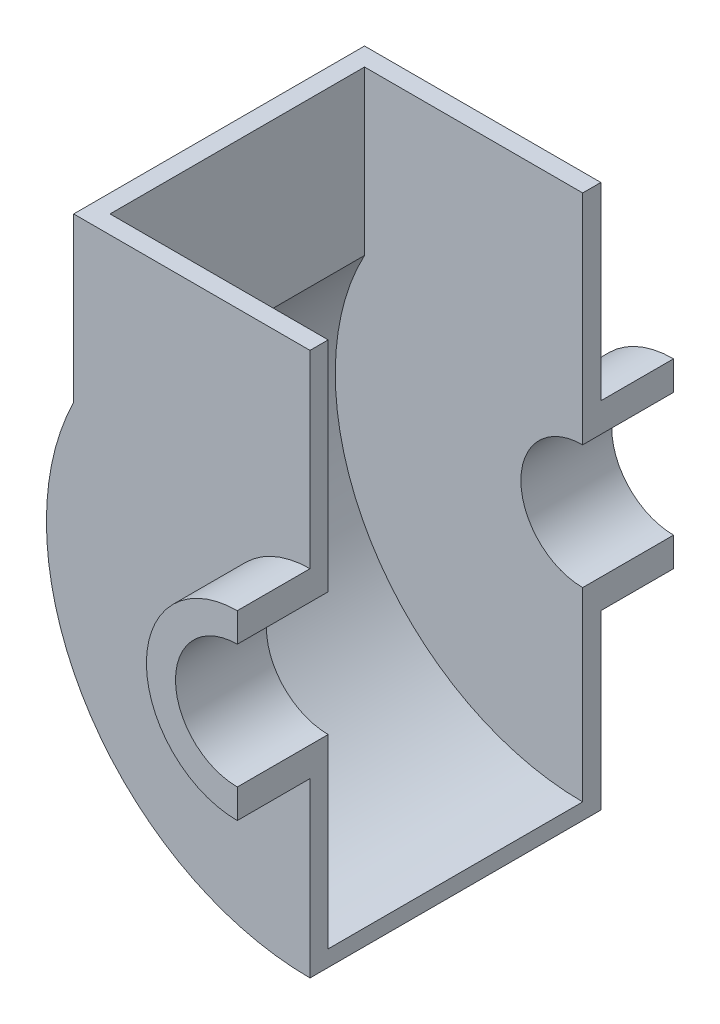
ISO-10303-21;
HEADER;
FILE_DESCRIPTION(('STEP AP214'),'2;1');
FILE_NAME('part.step','',(''),(''),'','','');
FILE_SCHEMA(('AUTOMOTIVE_DESIGN { 1 0 10303 214 1 1 1 1 }'));
ENDSEC;
DATA;
#1=APPLICATION_CONTEXT('core data for automotive mechanical design processes');
#2=APPLICATION_PROTOCOL_DEFINITION('international standard','automotive_design',2000,#1);
#3=PRODUCT_CONTEXT('',#1,'mechanical');
#4=PRODUCT('Part','Part','',(#3));
#5=PRODUCT_RELATED_PRODUCT_CATEGORY('part','',(#4));
#6=PRODUCT_DEFINITION_FORMATION('','',#4);
#7=PRODUCT_DEFINITION_CONTEXT('part definition',#1,'design');
#8=PRODUCT_DEFINITION('design','',#6,#7);
#9=PRODUCT_DEFINITION_SHAPE('','',#8);
#10=(LENGTH_UNIT() NAMED_UNIT(*) SI_UNIT(.MILLI.,.METRE.));
#11=(NAMED_UNIT(*) PLANE_ANGLE_UNIT() SI_UNIT($,.RADIAN.));
#12=(NAMED_UNIT(*) SI_UNIT($,.STERADIAN.) SOLID_ANGLE_UNIT());
#13=UNCERTAINTY_MEASURE_WITH_UNIT(LENGTH_MEASURE(1.E-05),#10,'distance_accuracy_value','');
#14=(GEOMETRIC_REPRESENTATION_CONTEXT(3) GLOBAL_UNCERTAINTY_ASSIGNED_CONTEXT((#13)) GLOBAL_UNIT_ASSIGNED_CONTEXT((#10,
#11,#12)) REPRESENTATION_CONTEXT('',''));
#15=CARTESIAN_POINT('',(0.,0.,0.));
#16=DIRECTION('',(0.,0.,1.));
#17=DIRECTION('',(1.,0.,0.));
#18=AXIS2_PLACEMENT_3D('',#15,#16,#17);
#19=CARTESIAN_POINT('',(0.,0.,-5.));
#20=DIRECTION('',(0.,0.,1.));
#21=DIRECTION('',(1.,0.,0.));
#22=AXIS2_PLACEMENT_3D('',#19,#20,#21);
#23=PLANE('',#22);
#24=CARTESIAN_POINT('',(0.,0.,-5.));
#25=DIRECTION('',(0.,0.,1.));
#26=DIRECTION('',(-1.,0.,0.));
#27=AXIS2_PLACEMENT_3D('',#24,#25,#26);
#28=CIRCLE('',#27,68.053287944081);
#29=CARTESIAN_POINT('',(-60.,32.1130814466628,-5.));
#30=VERTEX_POINT('',#29);
#31=CARTESIAN_POINT('',(0.,-68.053287944081,-5.));
#32=VERTEX_POINT('',#31);
#33=EDGE_CURVE('E195',#30,#32,#28,.T.);
#34=ORIENTED_EDGE('',*,*,#33,.F.);
#35=DIRECTION('',(0.,-1.,0.));
#36=VECTOR('',#35,1.);
#37=CARTESIAN_POINT('',(-60.,77.,-5.));
#38=LINE('',#37,#36);
#39=CARTESIAN_POINT('',(-60.,77.,-5.));
#40=VERTEX_POINT('',#39);
#41=EDGE_CURVE('E52',#40,#30,#38,.T.);
#42=ORIENTED_EDGE('',*,*,#41,.F.);
#43=DIRECTION('',(-1.,0.,0.));
#44=VECTOR('',#43,1.);
#45=CARTESIAN_POINT('',(0.,77.,-5.));
#46=LINE('',#45,#44);
#47=CARTESIAN_POINT('',(0.,77.,-5.));
#48=VERTEX_POINT('',#47);
#49=EDGE_CURVE('E211',#48,#40,#46,.T.);
#50=ORIENTED_EDGE('',*,*,#49,.F.);
#51=DIRECTION('',(0.,1.,0.));
#52=VECTOR('',#51,1.);
#53=CARTESIAN_POINT('',(0.,25.,-5.));
#54=LINE('',#53,#52);
#55=CARTESIAN_POINT('',(0.,17.,-5.));
#56=VERTEX_POINT('',#55);
#57=EDGE_CURVE('E252',#56,#48,#54,.T.);
#58=ORIENTED_EDGE('',*,*,#57,.F.);
#59=CARTESIAN_POINT('',(0.,0.,-5.));
#60=DIRECTION('',(0.,0.,-1.));
#61=DIRECTION('',(1.,0.,0.));
#62=AXIS2_PLACEMENT_3D('',#59,#60,#61);
#63=CIRCLE('',#62,17.);
#64=CARTESIAN_POINT('',(0.,-17.,-5.));
#65=VERTEX_POINT('',#64);
#66=EDGE_CURVE('E249',#65,#56,#63,.T.);
#67=ORIENTED_EDGE('',*,*,#66,.F.);
#68=DIRECTION('',(0.,1.,0.));
#69=VECTOR('',#68,1.);
#70=CARTESIAN_POINT('',(0.,-17.,-5.));
#71=LINE('',#70,#69);
#72=EDGE_CURVE('E58',#32,#65,#71,.T.);
#73=ORIENTED_EDGE('',*,*,#72,.F.);
#74=EDGE_LOOP('',(#34,#42,#50,#58,#67,#73));
#75=FACE_BOUND('',#74,.T.);
#76=ADVANCED_FACE('F35',(#75),#23,.F.);
#77=CARTESIAN_POINT('',(0.,0.,-5.));
#78=DIRECTION('',(0.,0.,1.));
#79=DIRECTION('',(1.,0.,0.));
#80=AXIS2_PLACEMENT_3D('',#77,#78,#79);
#81=CYLINDRICAL_SURFACE('',#80,17.);
#82=DIRECTION('',(0.,0.,1.));
#83=VECTOR('',#82,1.);
#84=CARTESIAN_POINT('',(0.,17.,-5.));
#85=LINE('',#84,#83);
#86=CARTESIAN_POINT('',(0.,17.,20.));
#87=VERTEX_POINT('',#86);
#88=EDGE_CURVE('E39',#56,#87,#85,.T.);
#89=ORIENTED_EDGE('',*,*,#88,.T.);
#90=CARTESIAN_POINT('',(0.,0.,20.));
#91=DIRECTION('',(0.,0.,-1.));
#92=DIRECTION('',(1.,0.,0.));
#93=AXIS2_PLACEMENT_3D('',#90,#91,#92);
#94=CIRCLE('',#93,17.);
#95=CARTESIAN_POINT('',(0.,-17.,20.));
#96=VERTEX_POINT('',#95);
#97=EDGE_CURVE('E232',#96,#87,#94,.T.);
#98=ORIENTED_EDGE('',*,*,#97,.F.);
#99=DIRECTION('',(0.,0.,1.));
#100=VECTOR('',#99,1.);
#101=CARTESIAN_POINT('',(0.,-17.,-5.));
#102=LINE('',#101,#100);
#103=EDGE_CURVE('E11',#65,#96,#102,.T.);
#104=ORIENTED_EDGE('',*,*,#103,.F.);
#105=ORIENTED_EDGE('',*,*,#66,.T.);
#106=EDGE_LOOP('',(#89,#98,#104,#105));
#107=FACE_BOUND('',#106,.T.);
#108=ADVANCED_FACE('F37',(#107),#81,.F.);
#109=CARTESIAN_POINT('',(0.,-17.,-5.));
#110=DIRECTION('',(1.,0.,0.));
#111=DIRECTION('',(0.,0.,-1.));
#112=AXIS2_PLACEMENT_3D('',#109,#110,#111);
#113=PLANE('',#112);
#114=ORIENTED_EDGE('',*,*,#103,.T.);
#115=DIRECTION('',(0.,1.,0.));
#116=VECTOR('',#115,1.);
#117=CARTESIAN_POINT('',(0.,-17.,20.));
#118=LINE('',#117,#116);
#119=CARTESIAN_POINT('',(0.,-25.,20.));
#120=VERTEX_POINT('',#119);
#121=EDGE_CURVE('E246',#120,#96,#118,.T.);
#122=ORIENTED_EDGE('',*,*,#121,.F.);
#123=DIRECTION('',(0.,0.,1.));
#124=VECTOR('',#123,1.);
#125=CARTESIAN_POINT('',(0.,-25.,-5.));
#126=LINE('',#125,#124);
#127=CARTESIAN_POINT('',(0.,-25.,0.));
#128=VERTEX_POINT('',#127);
#129=EDGE_CURVE('E44',#128,#120,#126,.T.);
#130=ORIENTED_EDGE('',*,*,#129,.F.);
#131=DIRECTION('',(0.,-1.,0.));
#132=VECTOR('',#131,1.);
#133=CARTESIAN_POINT('',(0.,0.,0.));
#134=LINE('',#133,#132);
#135=CARTESIAN_POINT('',(0.,-72.5,0.));
#136=VERTEX_POINT('',#135);
#137=EDGE_CURVE('E214',#128,#136,#134,.T.);
#138=ORIENTED_EDGE('',*,*,#137,.T.);
#139=DIRECTION('',(0.,0.,1.));
#140=VECTOR('',#139,1.);
#141=CARTESIAN_POINT('',(0.,-72.5,-5.));
#142=LINE('',#141,#140);
#143=CARTESIAN_POINT('',(0.,-72.5,-80.));
#144=VERTEX_POINT('',#143);
#145=EDGE_CURVE('E230',#144,#136,#142,.T.);
#146=ORIENTED_EDGE('',*,*,#145,.F.);
#147=DIRECTION('',(0.,-1.,0.));
#148=VECTOR('',#147,1.);
#149=CARTESIAN_POINT('',(0.,0.,-80.));
#150=LINE('',#149,#148);
#151=CARTESIAN_POINT('',(0.,-25.,-80.));
#152=VERTEX_POINT('',#151);
#153=EDGE_CURVE('E162',#152,#144,#150,.T.);
#154=ORIENTED_EDGE('',*,*,#153,.F.);
#155=DIRECTION('',(0.,0.,-1.));
#156=VECTOR('',#155,1.);
#157=CARTESIAN_POINT('',(0.,-25.,-75.));
#158=LINE('',#157,#156);
#159=CARTESIAN_POINT('',(0.,-25.,-100.));
#160=VERTEX_POINT('',#159);
#161=EDGE_CURVE('E188',#152,#160,#158,.T.);
#162=ORIENTED_EDGE('',*,*,#161,.T.);
#163=DIRECTION('',(0.,1.,0.));
#164=VECTOR('',#163,1.);
#165=CARTESIAN_POINT('',(0.,-17.,-100.));
#166=LINE('',#165,#164);
#167=CARTESIAN_POINT('',(0.,-17.,-100.));
#168=VERTEX_POINT('',#167);
#169=EDGE_CURVE('E181',#160,#168,#166,.T.);
#170=ORIENTED_EDGE('',*,*,#169,.T.);
#171=DIRECTION('',(0.,0.,-1.));
#172=VECTOR('',#171,1.);
#173=CARTESIAN_POINT('',(0.,-17.,-75.));
#174=LINE('',#173,#172);
#175=CARTESIAN_POINT('',(0.,-17.,-75.));
#176=VERTEX_POINT('',#175);
#177=EDGE_CURVE('E185',#176,#168,#174,.T.);
#178=ORIENTED_EDGE('',*,*,#177,.F.);
#179=DIRECTION('',(0.,1.,0.));
#180=VECTOR('',#179,1.);
#181=CARTESIAN_POINT('',(0.,-17.,-75.));
#182=LINE('',#181,#180);
#183=CARTESIAN_POINT('',(0.,-68.053287944081,-75.));
#184=VERTEX_POINT('',#183);
#185=EDGE_CURVE('E177',#184,#176,#182,.T.);
#186=ORIENTED_EDGE('',*,*,#185,.F.);
#187=DIRECTION('',(0.,0.,1.));
#188=VECTOR('',#187,1.);
#189=CARTESIAN_POINT('',(0.,-68.053287944081,-241.152038807834));
#190=LINE('',#189,#188);
#191=EDGE_CURVE('E198',#184,#32,#190,.T.);
#192=ORIENTED_EDGE('',*,*,#191,.T.);
#193=ORIENTED_EDGE('',*,*,#72,.T.);
#194=EDGE_LOOP('',(#114,#122,#130,#138,#146,#154,#162,#170,#178,#186,#192,#193));
#195=FACE_BOUND('',#194,.T.);
#196=ADVANCED_FACE('F270',(#195),#113,.T.);
#197=CARTESIAN_POINT('',(0.,0.,-5.));
#198=DIRECTION('',(0.,0.,1.));
#199=DIRECTION('',(1.,0.,0.));
#200=AXIS2_PLACEMENT_3D('',#197,#198,#199);
#201=CYLINDRICAL_SURFACE('',#200,25.);
#202=CARTESIAN_POINT('',(0.,0.,0.));
#203=DIRECTION('',(0.,0.,1.));
#204=DIRECTION('',(1.,0.,0.));
#205=AXIS2_PLACEMENT_3D('',#202,#203,#204);
#206=CIRCLE('',#205,25.);
#207=CARTESIAN_POINT('',(0.,25.,0.));
#208=VERTEX_POINT('',#207);
#209=EDGE_CURVE('E204',#208,#128,#206,.T.);
#210=ORIENTED_EDGE('',*,*,#209,.T.);
#211=ORIENTED_EDGE('',*,*,#129,.T.);
#212=CARTESIAN_POINT('',(0.,0.,20.));
#213=DIRECTION('',(0.,0.,1.));
#214=DIRECTION('',(1.,0.,0.));
#215=AXIS2_PLACEMENT_3D('',#212,#213,#214);
#216=CIRCLE('',#215,25.);
#217=CARTESIAN_POINT('',(0.,25.,20.));
#218=VERTEX_POINT('',#217);
#219=EDGE_CURVE('E243',#218,#120,#216,.T.);
#220=ORIENTED_EDGE('',*,*,#219,.F.);
#221=DIRECTION('',(0.,0.,1.));
#222=VECTOR('',#221,1.);
#223=CARTESIAN_POINT('',(0.,25.,-5.));
#224=LINE('',#223,#222);
#225=EDGE_CURVE('E255',#208,#218,#224,.T.);
#226=ORIENTED_EDGE('',*,*,#225,.F.);
#227=EDGE_LOOP('',(#210,#211,#220,#226));
#228=FACE_BOUND('',#227,.T.);
#229=ADVANCED_FACE('F278',(#228),#201,.T.);
#230=CARTESIAN_POINT('',(0.,25.,-5.));
#231=DIRECTION('',(1.,0.,0.));
#232=DIRECTION('',(0.,0.,-1.));
#233=AXIS2_PLACEMENT_3D('',#230,#231,#232);
#234=PLANE('',#233);
#235=ORIENTED_EDGE('',*,*,#57,.T.);
#236=DIRECTION('',(0.,0.,1.));
#237=VECTOR('',#236,1.);
#238=CARTESIAN_POINT('',(0.,77.,-5.));
#239=LINE('',#238,#237);
#240=CARTESIAN_POINT('',(0.,77.,0.));
#241=VERTEX_POINT('',#240);
#242=EDGE_CURVE('E213',#48,#241,#239,.T.);
#243=ORIENTED_EDGE('',*,*,#242,.T.);
#244=DIRECTION('',(0.,1.,0.));
#245=VECTOR('',#244,1.);
#246=CARTESIAN_POINT('',(0.,0.,0.));
#247=LINE('',#246,#245);
#248=EDGE_CURVE('E216',#208,#241,#247,.T.);
#249=ORIENTED_EDGE('',*,*,#248,.F.);
#250=ORIENTED_EDGE('',*,*,#225,.T.);
#251=DIRECTION('',(0.,1.,0.));
#252=VECTOR('',#251,1.);
#253=CARTESIAN_POINT('',(0.,25.,20.));
#254=LINE('',#253,#252);
#255=EDGE_CURVE('E240',#87,#218,#254,.T.);
#256=ORIENTED_EDGE('',*,*,#255,.F.);
#257=ORIENTED_EDGE('',*,*,#88,.F.);
#258=EDGE_LOOP('',(#235,#243,#249,#250,#256,#257));
#259=FACE_BOUND('',#258,.T.);
#260=ADVANCED_FACE('F263',(#259),#234,.T.);
#261=CARTESIAN_POINT('',(0.,0.,20.));
#262=DIRECTION('',(0.,0.,1.));
#263=DIRECTION('',(1.,0.,0.));
#264=AXIS2_PLACEMENT_3D('',#261,#262,#263);
#265=PLANE('',#264);
#266=ORIENTED_EDGE('',*,*,#97,.T.);
#267=ORIENTED_EDGE('',*,*,#255,.T.);
#268=ORIENTED_EDGE('',*,*,#219,.T.);
#269=ORIENTED_EDGE('',*,*,#121,.T.);
#270=EDGE_LOOP('',(#266,#267,#268,#269));
#271=FACE_BOUND('',#270,.T.);
#272=ADVANCED_FACE('F266',(#271),#265,.T.);
#273=CARTESIAN_POINT('',(0.,0.,-5.));
#274=DIRECTION('',(0.,0.,1.));
#275=DIRECTION('',(1.,0.,0.));
#276=AXIS2_PLACEMENT_3D('',#273,#274,#275);
#277=CYLINDRICAL_SURFACE('',#276,72.5);
#278=CARTESIAN_POINT('',(0.,0.,0.));
#279=DIRECTION('',(0.,0.,1.));
#280=DIRECTION('',(1.,0.,0.));
#281=AXIS2_PLACEMENT_3D('',#278,#279,#280);
#282=CIRCLE('',#281,72.5);
#283=CARTESIAN_POINT('',(-65.,32.1130814466628,0.));
#284=VERTEX_POINT('',#283);
#285=EDGE_CURVE('E225',#284,#136,#282,.T.);
#286=ORIENTED_EDGE('',*,*,#285,.F.);
#287=DIRECTION('',(0.,0.,1.));
#288=VECTOR('',#287,1.);
#289=CARTESIAN_POINT('',(-65.,32.1130814466628,-5.));
#290=LINE('',#289,#288);
#291=CARTESIAN_POINT('',(-65.,32.1130814466628,-80.));
#292=VERTEX_POINT('',#291);
#293=EDGE_CURVE('E233',#292,#284,#290,.T.);
#294=ORIENTED_EDGE('',*,*,#293,.F.);
#295=CARTESIAN_POINT('',(0.,0.,-80.));
#296=DIRECTION('',(0.,0.,1.));
#297=DIRECTION('',(1.,0.,0.));
#298=AXIS2_PLACEMENT_3D('',#295,#296,#297);
#299=CIRCLE('',#298,72.5);
#300=EDGE_CURVE('E346',#292,#144,#299,.T.);
#301=ORIENTED_EDGE('',*,*,#300,.T.);
#302=ORIENTED_EDGE('',*,*,#145,.T.);
#303=EDGE_LOOP('',(#286,#294,#301,#302));
#304=FACE_BOUND('',#303,.T.);
#305=ADVANCED_FACE('F294',(#304),#277,.T.);
#306=CARTESIAN_POINT('',(-65.,0.,-5.));
#307=DIRECTION('',(-1.,0.,0.));
#308=DIRECTION('',(0.,0.,1.));
#309=AXIS2_PLACEMENT_3D('',#306,#307,#308);
#310=PLANE('',#309);
#311=DIRECTION('',(0.,-1.,0.));
#312=VECTOR('',#311,1.);
#313=CARTESIAN_POINT('',(-65.,0.,0.));
#314=LINE('',#313,#312);
#315=CARTESIAN_POINT('',(-65.,77.,0.));
#316=VERTEX_POINT('',#315);
#317=EDGE_CURVE('E222',#316,#284,#314,.T.);
#318=ORIENTED_EDGE('',*,*,#317,.F.);
#319=DIRECTION('',(0.,0.,1.));
#320=VECTOR('',#319,1.);
#321=CARTESIAN_POINT('',(-65.,77.,-5.));
#322=LINE('',#321,#320);
#323=CARTESIAN_POINT('',(-65.,77.,-80.));
#324=VERTEX_POINT('',#323);
#325=EDGE_CURVE('E235',#324,#316,#322,.T.);
#326=ORIENTED_EDGE('',*,*,#325,.F.);
#327=DIRECTION('',(0.,-1.,0.));
#328=VECTOR('',#327,1.);
#329=CARTESIAN_POINT('',(-65.,0.,-80.));
#330=LINE('',#329,#328);
#331=EDGE_CURVE('E348',#324,#292,#330,.T.);
#332=ORIENTED_EDGE('',*,*,#331,.T.);
#333=ORIENTED_EDGE('',*,*,#293,.T.);
#334=EDGE_LOOP('',(#318,#326,#332,#333));
#335=FACE_BOUND('',#334,.T.);
#336=ADVANCED_FACE('F297',(#335),#310,.T.);
#337=CARTESIAN_POINT('',(0.,77.,-5.));
#338=DIRECTION('',(0.,1.,0.));
#339=DIRECTION('',(-1.,0.,0.));
#340=AXIS2_PLACEMENT_3D('',#337,#338,#339);
#341=PLANE('',#340);
#342=DIRECTION('',(-1.,0.,0.));
#343=VECTOR('',#342,1.);
#344=CARTESIAN_POINT('',(0.,77.,0.));
#345=LINE('',#344,#343);
#346=EDGE_CURVE('E219',#241,#316,#345,.T.);
#347=ORIENTED_EDGE('',*,*,#346,.F.);
#348=ORIENTED_EDGE('',*,*,#242,.F.);
#349=ORIENTED_EDGE('',*,*,#49,.T.);
#350=DIRECTION('',(0.,0.,1.));
#351=VECTOR('',#350,1.);
#352=CARTESIAN_POINT('',(-60.,77.,-241.152038807834));
#353=LINE('',#352,#351);
#354=CARTESIAN_POINT('',(-60.,77.,-75.0000000000001));
#355=VERTEX_POINT('',#354);
#356=EDGE_CURVE('E158',#355,#40,#353,.T.);
#357=ORIENTED_EDGE('',*,*,#356,.F.);
#358=DIRECTION('',(-1.,0.,0.));
#359=VECTOR('',#358,1.);
#360=CARTESIAN_POINT('',(0.,77.,-75.));
#361=LINE('',#360,#359);
#362=CARTESIAN_POINT('',(0.,77.,-75.));
#363=VERTEX_POINT('',#362);
#364=EDGE_CURVE('E150',#363,#355,#361,.T.);
#365=ORIENTED_EDGE('',*,*,#364,.F.);
#366=DIRECTION('',(0.,0.,-1.));
#367=VECTOR('',#366,1.);
#368=CARTESIAN_POINT('',(0.,77.,-75.));
#369=LINE('',#368,#367);
#370=CARTESIAN_POINT('',(0.,77.,-80.));
#371=VERTEX_POINT('',#370);
#372=EDGE_CURVE('E155',#363,#371,#369,.T.);
#373=ORIENTED_EDGE('',*,*,#372,.T.);
#374=DIRECTION('',(-1.,0.,0.));
#375=VECTOR('',#374,1.);
#376=CARTESIAN_POINT('',(0.,77.,-80.));
#377=LINE('',#376,#375);
#378=EDGE_CURVE('E362',#371,#324,#377,.T.);
#379=ORIENTED_EDGE('',*,*,#378,.T.);
#380=ORIENTED_EDGE('',*,*,#325,.T.);
#381=EDGE_LOOP('',(#347,#348,#349,#357,#365,#373,#379,#380));
#382=FACE_BOUND('',#381,.T.);
#383=ADVANCED_FACE('F153',(#382),#341,.T.);
#384=CARTESIAN_POINT('',(0.,0.,0.));
#385=DIRECTION('',(0.,0.,1.));
#386=DIRECTION('',(1.,0.,0.));
#387=AXIS2_PLACEMENT_3D('',#384,#385,#386);
#388=PLANE('',#387);
#389=ORIENTED_EDGE('',*,*,#209,.F.);
#390=ORIENTED_EDGE('',*,*,#248,.T.);
#391=ORIENTED_EDGE('',*,*,#346,.T.);
#392=ORIENTED_EDGE('',*,*,#317,.T.);
#393=ORIENTED_EDGE('',*,*,#285,.T.);
#394=ORIENTED_EDGE('',*,*,#137,.F.);
#395=EDGE_LOOP('',(#389,#390,#391,#392,#393,#394));
#396=FACE_BOUND('',#395,.T.);
#397=ADVANCED_FACE('F276',(#396),#388,.T.);
#398=CARTESIAN_POINT('',(-60.,77.,-241.152038807834));
#399=DIRECTION('',(-1.,0.,0.));
#400=DIRECTION('',(0.,-1.,0.));
#401=AXIS2_PLACEMENT_3D('',#398,#399,#400);
#402=PLANE('',#401);
#403=DIRECTION('',(0.,-1.,0.));
#404=VECTOR('',#403,1.);
#405=CARTESIAN_POINT('',(-60.,77.,-75.));
#406=LINE('',#405,#404);
#407=CARTESIAN_POINT('',(-60.,32.1130814466628,-75.0000000000001));
#408=VERTEX_POINT('',#407);
#409=EDGE_CURVE('E205',#355,#408,#406,.T.);
#410=ORIENTED_EDGE('',*,*,#409,.F.);
#411=ORIENTED_EDGE('',*,*,#356,.T.);
#412=ORIENTED_EDGE('',*,*,#41,.T.);
#413=DIRECTION('',(0.,0.,1.));
#414=VECTOR('',#413,1.);
#415=CARTESIAN_POINT('',(-60.,32.1130814466628,-241.152038807834));
#416=LINE('',#415,#414);
#417=EDGE_CURVE('E199',#408,#30,#416,.T.);
#418=ORIENTED_EDGE('',*,*,#417,.F.);
#419=EDGE_LOOP('',(#410,#411,#412,#418));
#420=FACE_BOUND('',#419,.T.);
#421=ADVANCED_FACE('F306',(#420),#402,.F.);
#422=CARTESIAN_POINT('',(0.,0.,-241.152038807834));
#423=DIRECTION('',(0.,0.,1.));
#424=DIRECTION('',(1.,0.,0.));
#425=AXIS2_PLACEMENT_3D('',#422,#423,#424);
#426=CYLINDRICAL_SURFACE('',#425,68.053287944081);
#427=CARTESIAN_POINT('',(0.,0.,-75.));
#428=DIRECTION('',(0.,0.,-1.));
#429=DIRECTION('',(-1.,0.,0.));
#430=AXIS2_PLACEMENT_3D('',#427,#428,#429);
#431=CIRCLE('',#430,68.053287944081);
#432=EDGE_CURVE('E201',#408,#184,#431,.F.);
#433=ORIENTED_EDGE('',*,*,#432,.F.);
#434=ORIENTED_EDGE('',*,*,#417,.T.);
#435=ORIENTED_EDGE('',*,*,#33,.T.);
#436=ORIENTED_EDGE('',*,*,#191,.F.);
#437=EDGE_LOOP('',(#433,#434,#435,#436));
#438=FACE_BOUND('',#437,.T.);
#439=ADVANCED_FACE('F309',(#438),#426,.F.);
#440=CARTESIAN_POINT('',(0.,0.,-75.));
#441=DIRECTION('',(0.,0.,-1.));
#442=DIRECTION('',(1.,0.,0.));
#443=AXIS2_PLACEMENT_3D('',#440,#441,#442);
#444=PLANE('',#443);
#445=ORIENTED_EDGE('',*,*,#364,.T.);
#446=ORIENTED_EDGE('',*,*,#409,.T.);
#447=ORIENTED_EDGE('',*,*,#432,.T.);
#448=ORIENTED_EDGE('',*,*,#185,.T.);
#449=CARTESIAN_POINT('',(0.,0.,-75.));
#450=DIRECTION('',(0.,0.,-1.));
#451=DIRECTION('',(1.,0.,0.));
#452=AXIS2_PLACEMENT_3D('',#449,#450,#451);
#453=CIRCLE('',#452,17.);
#454=CARTESIAN_POINT('',(0.,17.,-75.));
#455=VERTEX_POINT('',#454);
#456=EDGE_CURVE('E175',#176,#455,#453,.T.);
#457=ORIENTED_EDGE('',*,*,#456,.T.);
#458=DIRECTION('',(0.,1.,0.));
#459=VECTOR('',#458,1.);
#460=CARTESIAN_POINT('',(0.,25.,-75.));
#461=LINE('',#460,#459);
#462=EDGE_CURVE('E167',#455,#363,#461,.T.);
#463=ORIENTED_EDGE('',*,*,#462,.T.);
#464=EDGE_LOOP('',(#445,#446,#447,#448,#457,#463));
#465=FACE_BOUND('',#464,.T.);
#466=ADVANCED_FACE('F173',(#465),#444,.F.);
#467=CARTESIAN_POINT('',(0.,0.,-75.));
#468=DIRECTION('',(0.,0.,-1.));
#469=DIRECTION('',(1.,0.,0.));
#470=AXIS2_PLACEMENT_3D('',#467,#468,#469);
#471=CYLINDRICAL_SURFACE('',#470,17.);
#472=DIRECTION('',(0.,0.,-1.));
#473=VECTOR('',#472,1.);
#474=CARTESIAN_POINT('',(0.,17.,-75.));
#475=LINE('',#474,#473);
#476=CARTESIAN_POINT('',(0.,17.,-100.));
#477=VERTEX_POINT('',#476);
#478=EDGE_CURVE('E179',#455,#477,#475,.T.);
#479=ORIENTED_EDGE('',*,*,#478,.F.);
#480=ORIENTED_EDGE('',*,*,#456,.F.);
#481=ORIENTED_EDGE('',*,*,#177,.T.);
#482=CARTESIAN_POINT('',(0.,0.,-100.));
#483=DIRECTION('',(0.,0.,-1.));
#484=DIRECTION('',(1.,0.,0.));
#485=AXIS2_PLACEMENT_3D('',#482,#483,#484);
#486=CIRCLE('',#485,17.);
#487=EDGE_CURVE('E171',#168,#477,#486,.T.);
#488=ORIENTED_EDGE('',*,*,#487,.T.);
#489=EDGE_LOOP('',(#479,#480,#481,#488));
#490=FACE_BOUND('',#489,.T.);
#491=ADVANCED_FACE('F314',(#490),#471,.F.);
#492=CARTESIAN_POINT('',(0.,0.,-75.));
#493=DIRECTION('',(0.,0.,-1.));
#494=DIRECTION('',(1.,0.,0.));
#495=AXIS2_PLACEMENT_3D('',#492,#493,#494);
#496=CYLINDRICAL_SURFACE('',#495,25.);
#497=CARTESIAN_POINT('',(0.,0.,-80.));
#498=DIRECTION('',(0.,0.,1.));
#499=DIRECTION('',(1.,0.,0.));
#500=AXIS2_PLACEMENT_3D('',#497,#498,#499);
#501=CIRCLE('',#500,25.);
#502=CARTESIAN_POINT('',(0.,25.,-80.));
#503=VERTEX_POINT('',#502);
#504=EDGE_CURVE('E337',#503,#152,#501,.T.);
#505=ORIENTED_EDGE('',*,*,#504,.F.);
#506=DIRECTION('',(0.,0.,-1.));
#507=VECTOR('',#506,1.);
#508=CARTESIAN_POINT('',(0.,25.,-75.));
#509=LINE('',#508,#507);
#510=CARTESIAN_POINT('',(0.,25.,-100.));
#511=VERTEX_POINT('',#510);
#512=EDGE_CURVE('E191',#503,#511,#509,.T.);
#513=ORIENTED_EDGE('',*,*,#512,.T.);
#514=CARTESIAN_POINT('',(0.,0.,-100.));
#515=DIRECTION('',(0.,0.,1.));
#516=DIRECTION('',(1.,0.,0.));
#517=AXIS2_PLACEMENT_3D('',#514,#515,#516);
#518=CIRCLE('',#517,25.);
#519=EDGE_CURVE('E343',#511,#160,#518,.T.);
#520=ORIENTED_EDGE('',*,*,#519,.T.);
#521=ORIENTED_EDGE('',*,*,#161,.F.);
#522=EDGE_LOOP('',(#505,#513,#520,#521));
#523=FACE_BOUND('',#522,.T.);
#524=ADVANCED_FACE('F317',(#523),#496,.T.);
#525=CARTESIAN_POINT('',(0.,25.,-75.));
#526=DIRECTION('',(1.,0.,0.));
#527=DIRECTION('',(0.,0.,1.));
#528=AXIS2_PLACEMENT_3D('',#525,#526,#527);
#529=PLANE('',#528);
#530=ORIENTED_EDGE('',*,*,#462,.F.);
#531=ORIENTED_EDGE('',*,*,#478,.T.);
#532=DIRECTION('',(0.,1.,0.));
#533=VECTOR('',#532,1.);
#534=CARTESIAN_POINT('',(0.,25.,-100.));
#535=LINE('',#534,#533);
#536=EDGE_CURVE('E354',#477,#511,#535,.T.);
#537=ORIENTED_EDGE('',*,*,#536,.T.);
#538=ORIENTED_EDGE('',*,*,#512,.F.);
#539=DIRECTION('',(0.,1.,0.));
#540=VECTOR('',#539,1.);
#541=CARTESIAN_POINT('',(0.,0.,-80.));
#542=LINE('',#541,#540);
#543=EDGE_CURVE('E170',#503,#371,#542,.T.);
#544=ORIENTED_EDGE('',*,*,#543,.T.);
#545=ORIENTED_EDGE('',*,*,#372,.F.);
#546=EDGE_LOOP('',(#530,#531,#537,#538,#544,#545));
#547=FACE_BOUND('',#546,.T.);
#548=ADVANCED_FACE('F165',(#547),#529,.T.);
#549=CARTESIAN_POINT('',(0.,0.,-100.));
#550=DIRECTION('',(0.,0.,-1.));
#551=DIRECTION('',(1.,0.,0.));
#552=AXIS2_PLACEMENT_3D('',#549,#550,#551);
#553=PLANE('',#552);
#554=ORIENTED_EDGE('',*,*,#487,.F.);
#555=ORIENTED_EDGE('',*,*,#169,.F.);
#556=ORIENTED_EDGE('',*,*,#519,.F.);
#557=ORIENTED_EDGE('',*,*,#536,.F.);
#558=EDGE_LOOP('',(#554,#555,#556,#557));
#559=FACE_BOUND('',#558,.T.);
#560=ADVANCED_FACE('F321',(#559),#553,.T.);
#561=CARTESIAN_POINT('',(0.,0.,-80.));
#562=DIRECTION('',(0.,0.,-1.));
#563=DIRECTION('',(1.,0.,0.));
#564=AXIS2_PLACEMENT_3D('',#561,#562,#563);
#565=PLANE('',#564);
#566=ORIENTED_EDGE('',*,*,#504,.T.);
#567=ORIENTED_EDGE('',*,*,#153,.T.);
#568=ORIENTED_EDGE('',*,*,#300,.F.);
#569=ORIENTED_EDGE('',*,*,#331,.F.);
#570=ORIENTED_EDGE('',*,*,#378,.F.);
#571=ORIENTED_EDGE('',*,*,#543,.F.);
#572=EDGE_LOOP('',(#566,#567,#568,#569,#570,#571));
#573=FACE_BOUND('',#572,.T.);
#574=ADVANCED_FACE('F329',(#573),#565,.T.);
#575=CLOSED_SHELL('',(#76,#108,#196,#229,#260,#272,#305,#336,#383,#397,#421,#439,#466,#491,#524,
#548,#560,#574));
#576=MANIFOLD_SOLID_BREP('B2',#575);
#577=ADVANCED_BREP_SHAPE_REPRESENTATION('',(#18,#576),#14);
#578=SHAPE_DEFINITION_REPRESENTATION(#9,#577);
ENDSEC;
END-ISO-10303-21;
